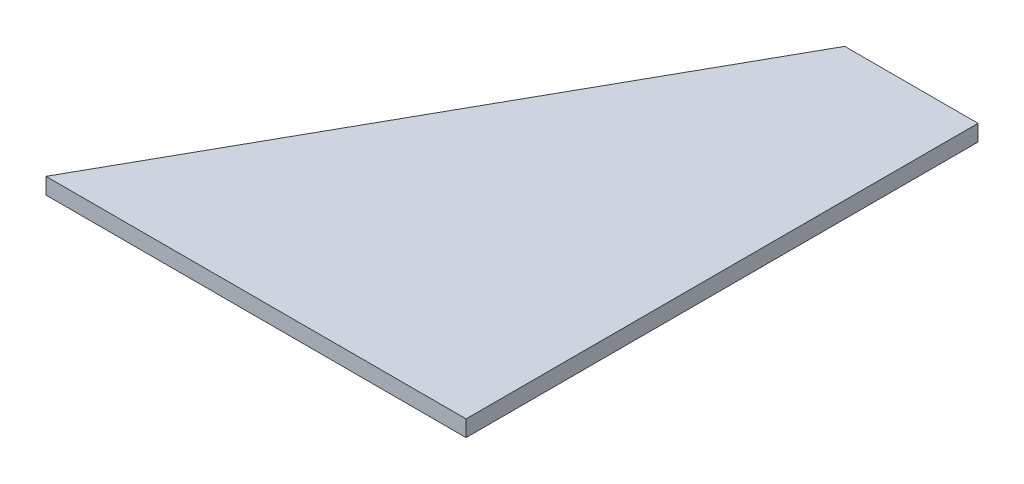
ISO-10303-21;
HEADER;
FILE_DESCRIPTION(('STEP AP214'),'2;1');
FILE_NAME('part.step','',(''),(''),'','','');
FILE_SCHEMA(('AUTOMOTIVE_DESIGN { 1 0 10303 214 1 1 1 1 }'));
ENDSEC;
DATA;
#1=APPLICATION_CONTEXT('core data for automotive mechanical design processes');
#2=APPLICATION_PROTOCOL_DEFINITION('international standard','automotive_design',2000,#1);
#3=PRODUCT_CONTEXT('',#1,'mechanical');
#4=PRODUCT('Part','Part','',(#3));
#5=PRODUCT_RELATED_PRODUCT_CATEGORY('part','',(#4));
#6=PRODUCT_DEFINITION_FORMATION('','',#4);
#7=PRODUCT_DEFINITION_CONTEXT('part definition',#1,'design');
#8=PRODUCT_DEFINITION('design','',#6,#7);
#9=PRODUCT_DEFINITION_SHAPE('','',#8);
#10=(LENGTH_UNIT() NAMED_UNIT(*) SI_UNIT(.MILLI.,.METRE.));
#11=(NAMED_UNIT(*) PLANE_ANGLE_UNIT() SI_UNIT($,.RADIAN.));
#12=(NAMED_UNIT(*) SI_UNIT($,.STERADIAN.) SOLID_ANGLE_UNIT());
#13=UNCERTAINTY_MEASURE_WITH_UNIT(LENGTH_MEASURE(1.E-05),#10,'distance_accuracy_value','');
#14=(GEOMETRIC_REPRESENTATION_CONTEXT(3) GLOBAL_UNCERTAINTY_ASSIGNED_CONTEXT((#13)) GLOBAL_UNIT_ASSIGNED_CONTEXT((#10,
#11,#12)) REPRESENTATION_CONTEXT('',''));
#15=CARTESIAN_POINT('',(0.,0.,0.));
#16=DIRECTION('',(0.,0.,1.));
#17=DIRECTION('',(1.,0.,0.));
#18=AXIS2_PLACEMENT_3D('',#15,#16,#17);
#19=CARTESIAN_POINT('',(-225.902961689226,10.,248.954145579287));
#20=DIRECTION('',(0.872420355163479,0.,0.488756303178209));
#21=DIRECTION('',(0.488756303178209,0.,-0.872420355163479));
#22=AXIS2_PLACEMENT_3D('',#19,#20,#21);
#23=PLANE('',#22);
#24=DIRECTION('',(-0.488756303178209,0.,0.872420355163479));
#25=VECTOR('',#24,1.);
#26=CARTESIAN_POINT('',(-225.902961689226,0.,248.954145579287));
#27=LINE('',#26,#25);
#28=CARTESIAN_POINT('',(-49.4304222878653,0.,-66.0458544207134));
#29=VERTEX_POINT('',#28);
#30=CARTESIAN_POINT('',(-225.902961689226,0.,248.954145579287));
#31=VERTEX_POINT('',#30);
#32=EDGE_CURVE('E107',#29,#31,#27,.T.);
#33=ORIENTED_EDGE('',*,*,#32,.T.);
#34=DIRECTION('',(0.,-1.,0.));
#35=VECTOR('',#34,1.);
#36=CARTESIAN_POINT('',(-225.902961689226,10.,248.954145579287));
#37=LINE('',#36,#35);
#38=CARTESIAN_POINT('',(-225.902961689226,10.,248.954145579287));
#39=VERTEX_POINT('',#38);
#40=EDGE_CURVE('E11',#39,#31,#37,.T.);
#41=ORIENTED_EDGE('',*,*,#40,.F.);
#42=DIRECTION('',(-0.488756303178209,0.,0.872420355163479));
#43=VECTOR('',#42,1.);
#44=CARTESIAN_POINT('',(-225.902961689226,10.,248.954145579287));
#45=LINE('',#44,#43);
#46=CARTESIAN_POINT('',(-49.4304222878653,10.,-66.0458544207134));
#47=VERTEX_POINT('',#46);
#48=EDGE_CURVE('E91',#47,#39,#45,.T.);
#49=ORIENTED_EDGE('',*,*,#48,.F.);
#50=DIRECTION('',(0.,-1.,0.));
#51=VECTOR('',#50,1.);
#52=CARTESIAN_POINT('',(-49.4304222878653,10.,-66.0458544207134));
#53=LINE('',#52,#51);
#54=EDGE_CURVE('E103',#47,#29,#53,.T.);
#55=ORIENTED_EDGE('',*,*,#54,.T.);
#56=EDGE_LOOP('',(#33,#41,#49,#55));
#57=FACE_BOUND('',#56,.T.);
#58=ADVANCED_FACE('F39',(#57),#23,.F.);
#59=CARTESIAN_POINT('',(32.5695777121347,10.,248.954145579287));
#60=DIRECTION('',(0.,0.,-1.));
#61=DIRECTION('',(-1.,0.,0.));
#62=AXIS2_PLACEMENT_3D('',#59,#60,#61);
#63=PLANE('',#62);
#64=DIRECTION('',(1.,0.,0.));
#65=VECTOR('',#64,1.);
#66=CARTESIAN_POINT('',(32.5695777121347,0.,248.954145579287));
#67=LINE('',#66,#65);
#68=CARTESIAN_POINT('',(32.5695777121347,0.,248.954145579287));
#69=VERTEX_POINT('',#68);
#70=EDGE_CURVE('E96',#31,#69,#67,.T.);
#71=ORIENTED_EDGE('',*,*,#70,.T.);
#72=DIRECTION('',(0.,-1.,0.));
#73=VECTOR('',#72,1.);
#74=CARTESIAN_POINT('',(32.5695777121347,10.,248.954145579287));
#75=LINE('',#74,#73);
#76=CARTESIAN_POINT('',(32.5695777121347,10.,248.954145579287));
#77=VERTEX_POINT('',#76);
#78=EDGE_CURVE('E48',#77,#69,#75,.T.);
#79=ORIENTED_EDGE('',*,*,#78,.F.);
#80=DIRECTION('',(1.,0.,0.));
#81=VECTOR('',#80,1.);
#82=CARTESIAN_POINT('',(32.5695777121347,10.,248.954145579287));
#83=LINE('',#82,#81);
#84=EDGE_CURVE('E86',#39,#77,#83,.T.);
#85=ORIENTED_EDGE('',*,*,#84,.F.);
#86=ORIENTED_EDGE('',*,*,#40,.T.);
#87=EDGE_LOOP('',(#71,#79,#85,#86));
#88=FACE_BOUND('',#87,.T.);
#89=ADVANCED_FACE('F95',(#88),#63,.F.);
#90=CARTESIAN_POINT('',(32.5695777121347,10.,-66.0458544207134));
#91=DIRECTION('',(-1.,0.,0.));
#92=DIRECTION('',(0.,0.,1.));
#93=AXIS2_PLACEMENT_3D('',#90,#91,#92);
#94=PLANE('',#93);
#95=DIRECTION('',(0.,0.,-1.));
#96=VECTOR('',#95,1.);
#97=CARTESIAN_POINT('',(32.5695777121347,0.,-66.0458544207134));
#98=LINE('',#97,#96);
#99=CARTESIAN_POINT('',(32.5695777121347,0.,-66.0458544207134));
#100=VERTEX_POINT('',#99);
#101=EDGE_CURVE('E73',#69,#100,#98,.T.);
#102=ORIENTED_EDGE('',*,*,#101,.T.);
#103=DIRECTION('',(0.,-1.,0.));
#104=VECTOR('',#103,1.);
#105=CARTESIAN_POINT('',(32.5695777121347,10.,-66.0458544207134));
#106=LINE('',#105,#104);
#107=CARTESIAN_POINT('',(32.5695777121347,10.,-66.0458544207134));
#108=VERTEX_POINT('',#107);
#109=EDGE_CURVE('E98',#108,#100,#106,.T.);
#110=ORIENTED_EDGE('',*,*,#109,.F.);
#111=DIRECTION('',(0.,0.,-1.));
#112=VECTOR('',#111,1.);
#113=CARTESIAN_POINT('',(32.5695777121347,10.,-66.0458544207134));
#114=LINE('',#113,#112);
#115=EDGE_CURVE('E89',#77,#108,#114,.T.);
#116=ORIENTED_EDGE('',*,*,#115,.F.);
#117=ORIENTED_EDGE('',*,*,#78,.T.);
#118=EDGE_LOOP('',(#102,#110,#116,#117));
#119=FACE_BOUND('',#118,.T.);
#120=ADVANCED_FACE('F99',(#119),#94,.F.);
#121=CARTESIAN_POINT('',(-49.4304222878653,10.,-66.0458544207134));
#122=DIRECTION('',(0.,0.,1.));
#123=DIRECTION('',(1.,0.,0.));
#124=AXIS2_PLACEMENT_3D('',#121,#122,#123);
#125=PLANE('',#124);
#126=DIRECTION('',(-1.,0.,0.));
#127=VECTOR('',#126,1.);
#128=CARTESIAN_POINT('',(-49.4304222878653,0.,-66.0458544207134));
#129=LINE('',#128,#127);
#130=EDGE_CURVE('E79',#100,#29,#129,.T.);
#131=ORIENTED_EDGE('',*,*,#130,.T.);
#132=ORIENTED_EDGE('',*,*,#54,.F.);
#133=DIRECTION('',(-1.,0.,0.));
#134=VECTOR('',#133,1.);
#135=CARTESIAN_POINT('',(-49.4304222878653,10.,-66.0458544207134));
#136=LINE('',#135,#134);
#137=EDGE_CURVE('E56',#108,#47,#136,.T.);
#138=ORIENTED_EDGE('',*,*,#137,.F.);
#139=ORIENTED_EDGE('',*,*,#109,.T.);
#140=EDGE_LOOP('',(#131,#132,#138,#139));
#141=FACE_BOUND('',#140,.T.);
#142=ADVANCED_FACE('F120',(#141),#125,.F.);
#143=CARTESIAN_POINT('',(0.,10.,0.));
#144=DIRECTION('',(0.,-1.,0.));
#145=DIRECTION('',(0.,0.,-1.));
#146=AXIS2_PLACEMENT_3D('',#143,#144,#145);
#147=PLANE('',#146);
#148=ORIENTED_EDGE('',*,*,#48,.T.);
#149=ORIENTED_EDGE('',*,*,#84,.T.);
#150=ORIENTED_EDGE('',*,*,#115,.T.);
#151=ORIENTED_EDGE('',*,*,#137,.T.);
#152=EDGE_LOOP('',(#148,#149,#150,#151));
#153=FACE_BOUND('',#152,.T.);
#154=ADVANCED_FACE('F87',(#153),#147,.F.);
#155=CARTESIAN_POINT('',(0.,0.,0.));
#156=DIRECTION('',(0.,-1.,0.));
#157=DIRECTION('',(0.,0.,-1.));
#158=AXIS2_PLACEMENT_3D('',#155,#156,#157);
#159=PLANE('',#158);
#160=ORIENTED_EDGE('',*,*,#32,.F.);
#161=ORIENTED_EDGE('',*,*,#130,.F.);
#162=ORIENTED_EDGE('',*,*,#101,.F.);
#163=ORIENTED_EDGE('',*,*,#70,.F.);
#164=EDGE_LOOP('',(#160,#161,#162,#163));
#165=FACE_BOUND('',#164,.T.);
#166=ADVANCED_FACE('F123',(#165),#159,.T.);
#167=CLOSED_SHELL('',(#58,#89,#120,#142,#154,#166));
#168=MANIFOLD_SOLID_BREP('B2',#167);
#169=ADVANCED_BREP_SHAPE_REPRESENTATION('',(#18,#168),#14);
#170=SHAPE_DEFINITION_REPRESENTATION(#9,#169);
ENDSEC;
END-ISO-10303-21;
